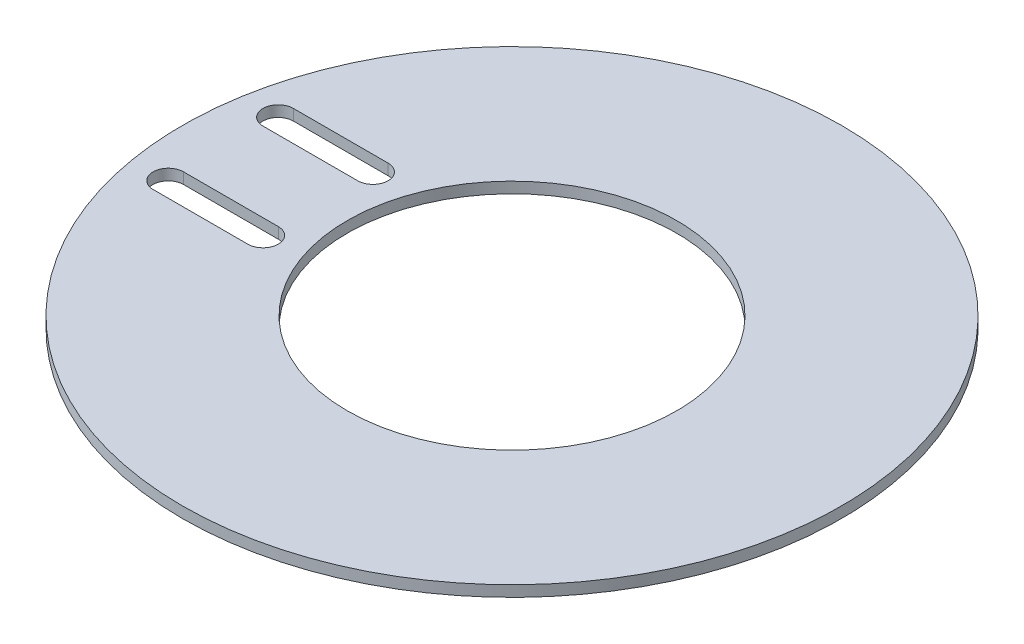
ISO-10303-21;
HEADER;
FILE_DESCRIPTION(('STEP AP214'),'2;1');
FILE_NAME('part.step','',(''),(''),'','','');
FILE_SCHEMA(('AUTOMOTIVE_DESIGN { 1 0 10303 214 1 1 1 1 }'));
ENDSEC;
DATA;
#1=APPLICATION_CONTEXT('core data for automotive mechanical design processes');
#2=APPLICATION_PROTOCOL_DEFINITION('international standard','automotive_design',2000,#1);
#3=PRODUCT_CONTEXT('',#1,'mechanical');
#4=PRODUCT('Part','Part','',(#3));
#5=PRODUCT_RELATED_PRODUCT_CATEGORY('part','',(#4));
#6=PRODUCT_DEFINITION_FORMATION('','',#4);
#7=PRODUCT_DEFINITION_CONTEXT('part definition',#1,'design');
#8=PRODUCT_DEFINITION('design','',#6,#7);
#9=PRODUCT_DEFINITION_SHAPE('','',#8);
#10=(LENGTH_UNIT() NAMED_UNIT(*) SI_UNIT(.MILLI.,.METRE.));
#11=(NAMED_UNIT(*) PLANE_ANGLE_UNIT() SI_UNIT($,.RADIAN.));
#12=(NAMED_UNIT(*) SI_UNIT($,.STERADIAN.) SOLID_ANGLE_UNIT());
#13=UNCERTAINTY_MEASURE_WITH_UNIT(LENGTH_MEASURE(1.E-05),#10,'distance_accuracy_value','');
#14=(GEOMETRIC_REPRESENTATION_CONTEXT(3) GLOBAL_UNCERTAINTY_ASSIGNED_CONTEXT((#13)) GLOBAL_UNIT_ASSIGNED_CONTEXT((#10,
#11,#12)) REPRESENTATION_CONTEXT('',''));
#15=CARTESIAN_POINT('',(0.,0.,0.));
#16=DIRECTION('',(0.,0.,1.));
#17=DIRECTION('',(1.,0.,0.));
#18=AXIS2_PLACEMENT_3D('',#15,#16,#17);
#19=CARTESIAN_POINT('',(-36.9908571611625,31.4452,0.));
#20=DIRECTION('',(0.,1.,0.));
#21=DIRECTION('',(0.,0.,1.));
#22=AXIS2_PLACEMENT_3D('',#19,#20,#21);
#23=PLANE('',#22);
#24=CARTESIAN_POINT('',(-36.9908571611625,31.4452,0.));
#25=DIRECTION('',(0.,1.,0.));
#26=DIRECTION('',(0.,0.,1.));
#27=AXIS2_PLACEMENT_3D('',#24,#25,#26);
#28=CIRCLE('',#27,1810.512);
#29=CARTESIAN_POINT('',(-36.9908571611625,31.4452,1810.512));
#30=VERTEX_POINT('',#29);
#31=EDGE_CURVE('E11',#30,#30,#28,.T.);
#32=ORIENTED_EDGE('',*,*,#31,.T.);
#33=EDGE_LOOP('',(#32));
#34=FACE_BOUND('',#33,.T.);
#35=CARTESIAN_POINT('',(-36.9908571611625,31.4452,0.));
#36=DIRECTION('',(0.,1.,0.));
#37=DIRECTION('',(0.,0.,1.));
#38=AXIS2_PLACEMENT_3D('',#35,#36,#37);
#39=CIRCLE('',#38,905.256);
#40=CARTESIAN_POINT('',(-36.9908571611625,31.4452,905.256));
#41=VERTEX_POINT('',#40);
#42=EDGE_CURVE('E172',#41,#41,#39,.T.);
#43=ORIENTED_EDGE('',*,*,#42,.F.);
#44=EDGE_LOOP('',(#43));
#45=FACE_BOUND('',#44,.T.);
#46=DIRECTION('',(1.,0.,0.));
#47=VECTOR('',#46,1.);
#48=CARTESIAN_POINT('',(-1623.3628169712,31.4452,-217.967199131942));
#49=LINE('',#48,#47);
#50=CARTESIAN_POINT('',(-1623.3628169712,31.4452,-217.967199131942));
#51=VERTEX_POINT('',#50);
#52=CARTESIAN_POINT('',(-1102.88671838462,31.4452,-217.967199131942));
#53=VERTEX_POINT('',#52);
#54=EDGE_CURVE('E143',#51,#53,#49,.T.);
#55=ORIENTED_EDGE('',*,*,#54,.F.);
#56=CARTESIAN_POINT('',(-1623.3628169712,31.4452,-301.752));
#57=DIRECTION('',(0.,1.,0.));
#58=DIRECTION('',(0.,0.,1.));
#59=AXIS2_PLACEMENT_3D('',#56,#57,#58);
#60=CIRCLE('',#59,83.7848008680577);
#61=CARTESIAN_POINT('',(-1623.3628169712,31.4452,-385.536800868058));
#62=VERTEX_POINT('',#61);
#63=EDGE_CURVE('E141',#62,#51,#60,.T.);
#64=ORIENTED_EDGE('',*,*,#63,.F.);
#65=DIRECTION('',(-1.,0.,0.));
#66=VECTOR('',#65,1.);
#67=CARTESIAN_POINT('',(-1623.3628169712,31.4452,-385.536800868058));
#68=LINE('',#67,#66);
#69=CARTESIAN_POINT('',(-1102.88671838462,31.4452,-385.536800868058));
#70=VERTEX_POINT('',#69);
#71=EDGE_CURVE('E149',#70,#62,#68,.T.);
#72=ORIENTED_EDGE('',*,*,#71,.F.);
#73=CARTESIAN_POINT('',(-1102.88671838462,31.4452,-301.752));
#74=DIRECTION('',(0.,1.,0.));
#75=DIRECTION('',(0.,0.,1.));
#76=AXIS2_PLACEMENT_3D('',#73,#74,#75);
#77=CIRCLE('',#76,83.7848008680577);
#78=EDGE_CURVE('E146',#53,#70,#77,.T.);
#79=ORIENTED_EDGE('',*,*,#78,.F.);
#80=EDGE_LOOP('',(#55,#64,#72,#79));
#81=FACE_BOUND('',#80,.T.);
#82=DIRECTION('',(1.,0.,0.));
#83=VECTOR('',#82,1.);
#84=CARTESIAN_POINT('',(-1623.3628169712,31.4452,385.536800868058));
#85=LINE('',#84,#83);
#86=CARTESIAN_POINT('',(-1623.3628169712,31.4452,385.536800868058));
#87=VERTEX_POINT('',#86);
#88=CARTESIAN_POINT('',(-1102.88671838462,31.4452,385.536800868058));
#89=VERTEX_POINT('',#88);
#90=EDGE_CURVE('E113',#87,#89,#85,.T.);
#91=ORIENTED_EDGE('',*,*,#90,.F.);
#92=CARTESIAN_POINT('',(-1623.3628169712,31.4452,301.752));
#93=DIRECTION('',(0.,1.,0.));
#94=DIRECTION('',(0.,0.,-1.));
#95=AXIS2_PLACEMENT_3D('',#92,#93,#94);
#96=CIRCLE('',#95,83.7848008680577);
#97=CARTESIAN_POINT('',(-1623.3628169712,31.4452,217.967199131942));
#98=VERTEX_POINT('',#97);
#99=EDGE_CURVE('E105',#98,#87,#96,.T.);
#100=ORIENTED_EDGE('',*,*,#99,.F.);
#101=DIRECTION('',(-1.,0.,0.));
#102=VECTOR('',#101,1.);
#103=CARTESIAN_POINT('',(-1623.3628169712,31.4452,217.967199131942));
#104=LINE('',#103,#102);
#105=CARTESIAN_POINT('',(-1102.88671838462,31.4452,217.967199131942));
#106=VERTEX_POINT('',#105);
#107=EDGE_CURVE('E127',#106,#98,#104,.T.);
#108=ORIENTED_EDGE('',*,*,#107,.F.);
#109=CARTESIAN_POINT('',(-1102.88671838462,31.4452,301.752));
#110=DIRECTION('',(0.,1.,0.));
#111=DIRECTION('',(0.,0.,-1.));
#112=AXIS2_PLACEMENT_3D('',#109,#110,#111);
#113=CIRCLE('',#112,83.7848008680577);
#114=EDGE_CURVE('E125',#89,#106,#113,.T.);
#115=ORIENTED_EDGE('',*,*,#114,.F.);
#116=EDGE_LOOP('',(#91,#100,#108,#115));
#117=FACE_BOUND('',#116,.T.);
#118=ADVANCED_FACE('F40',(#34,#45,#81,#117),#23,.T.);
#119=CARTESIAN_POINT('',(-36.9908571611625,-28.9052,0.));
#120=DIRECTION('',(0.,1.,0.));
#121=DIRECTION('',(0.,0.,1.));
#122=AXIS2_PLACEMENT_3D('',#119,#120,#121);
#123=PLANE('',#122);
#124=CARTESIAN_POINT('',(-1623.3628169712,-28.9052,-301.752));
#125=DIRECTION('',(0.,1.,0.));
#126=DIRECTION('',(0.,0.,1.));
#127=AXIS2_PLACEMENT_3D('',#124,#125,#126);
#128=CIRCLE('',#127,83.7848008680577);
#129=CARTESIAN_POINT('',(-1623.3628169712,-28.9052,-385.536800868058));
#130=VERTEX_POINT('',#129);
#131=CARTESIAN_POINT('',(-1623.3628169712,-28.9052,-217.967199131942));
#132=VERTEX_POINT('',#131);
#133=EDGE_CURVE('E121',#130,#132,#128,.T.);
#134=ORIENTED_EDGE('',*,*,#133,.T.);
#135=DIRECTION('',(1.,0.,0.));
#136=VECTOR('',#135,1.);
#137=CARTESIAN_POINT('',(-1623.3628169712,-28.9052,-217.967199131942));
#138=LINE('',#137,#136);
#139=CARTESIAN_POINT('',(-1102.88671838462,-28.9052,-217.967199131942));
#140=VERTEX_POINT('',#139);
#141=EDGE_CURVE('E154',#132,#140,#138,.T.);
#142=ORIENTED_EDGE('',*,*,#141,.T.);
#143=CARTESIAN_POINT('',(-1102.88671838462,-28.9052,-301.752));
#144=DIRECTION('',(0.,1.,0.));
#145=DIRECTION('',(0.,0.,1.));
#146=AXIS2_PLACEMENT_3D('',#143,#144,#145);
#147=CIRCLE('',#146,83.7848008680577);
#148=CARTESIAN_POINT('',(-1102.88671838462,-28.9052,-385.536800868058));
#149=VERTEX_POINT('',#148);
#150=EDGE_CURVE('E157',#140,#149,#147,.T.);
#151=ORIENTED_EDGE('',*,*,#150,.T.);
#152=DIRECTION('',(-1.,0.,0.));
#153=VECTOR('',#152,1.);
#154=CARTESIAN_POINT('',(-1623.3628169712,-28.9052,-385.536800868058));
#155=LINE('',#154,#153);
#156=EDGE_CURVE('E144',#149,#130,#155,.T.);
#157=ORIENTED_EDGE('',*,*,#156,.T.);
#158=EDGE_LOOP('',(#134,#142,#151,#157));
#159=FACE_BOUND('',#158,.T.);
#160=CARTESIAN_POINT('',(-36.9908571611625,-28.9052,0.));
#161=DIRECTION('',(0.,1.,0.));
#162=DIRECTION('',(0.,0.,1.));
#163=AXIS2_PLACEMENT_3D('',#160,#161,#162);
#164=CIRCLE('',#163,1810.512);
#165=CARTESIAN_POINT('',(-36.9908571611625,-28.9052,1810.512));
#166=VERTEX_POINT('',#165);
#167=EDGE_CURVE('E44',#166,#166,#164,.T.);
#168=ORIENTED_EDGE('',*,*,#167,.F.);
#169=EDGE_LOOP('',(#168));
#170=FACE_BOUND('',#169,.T.);
#171=CARTESIAN_POINT('',(-36.9908571611625,-28.9052,0.));
#172=DIRECTION('',(0.,1.,0.));
#173=DIRECTION('',(0.,0.,1.));
#174=AXIS2_PLACEMENT_3D('',#171,#172,#173);
#175=CIRCLE('',#174,905.256);
#176=CARTESIAN_POINT('',(-36.9908571611625,-28.9052,905.256));
#177=VERTEX_POINT('',#176);
#178=EDGE_CURVE('E171',#177,#177,#175,.T.);
#179=ORIENTED_EDGE('',*,*,#178,.T.);
#180=EDGE_LOOP('',(#179));
#181=FACE_BOUND('',#180,.T.);
#182=CARTESIAN_POINT('',(-1623.3628169712,-28.9052,301.752));
#183=DIRECTION('',(0.,1.,0.));
#184=DIRECTION('',(0.,0.,-1.));
#185=AXIS2_PLACEMENT_3D('',#182,#183,#184);
#186=CIRCLE('',#185,83.7848008680577);
#187=CARTESIAN_POINT('',(-1623.3628169712,-28.9052,217.967199131942));
#188=VERTEX_POINT('',#187);
#189=CARTESIAN_POINT('',(-1623.3628169712,-28.9052,385.536800868058));
#190=VERTEX_POINT('',#189);
#191=EDGE_CURVE('E63',#188,#190,#186,.T.);
#192=ORIENTED_EDGE('',*,*,#191,.T.);
#193=DIRECTION('',(1.,0.,0.));
#194=VECTOR('',#193,1.);
#195=CARTESIAN_POINT('',(-1623.3628169712,-28.9052,385.536800868058));
#196=LINE('',#195,#194);
#197=CARTESIAN_POINT('',(-1102.88671838462,-28.9052,385.536800868058));
#198=VERTEX_POINT('',#197);
#199=EDGE_CURVE('E120',#190,#198,#196,.T.);
#200=ORIENTED_EDGE('',*,*,#199,.T.);
#201=CARTESIAN_POINT('',(-1102.88671838462,-28.9052,301.752));
#202=DIRECTION('',(0.,1.,0.));
#203=DIRECTION('',(0.,0.,-1.));
#204=AXIS2_PLACEMENT_3D('',#201,#202,#203);
#205=CIRCLE('',#204,83.7848008680577);
#206=CARTESIAN_POINT('',(-1102.88671838462,-28.9052,217.967199131942));
#207=VERTEX_POINT('',#206);
#208=EDGE_CURVE('E133',#198,#207,#205,.T.);
#209=ORIENTED_EDGE('',*,*,#208,.T.);
#210=DIRECTION('',(-1.,0.,0.));
#211=VECTOR('',#210,1.);
#212=CARTESIAN_POINT('',(-1623.3628169712,-28.9052,217.967199131942));
#213=LINE('',#212,#211);
#214=EDGE_CURVE('E114',#207,#188,#213,.T.);
#215=ORIENTED_EDGE('',*,*,#214,.T.);
#216=EDGE_LOOP('',(#192,#200,#209,#215));
#217=FACE_BOUND('',#216,.T.);
#218=ADVANCED_FACE('F178',(#159,#170,#181,#217),#123,.F.);
#219=CARTESIAN_POINT('',(-36.9908571611625,31.4452,0.));
#220=DIRECTION('',(0.,-1.,0.));
#221=DIRECTION('',(0.,0.,-1.));
#222=AXIS2_PLACEMENT_3D('',#219,#220,#221);
#223=CYLINDRICAL_SURFACE('',#222,1810.512);
#224=ORIENTED_EDGE('',*,*,#31,.F.);
#225=EDGE_LOOP('',(#224));
#226=FACE_BOUND('',#225,.T.);
#227=ORIENTED_EDGE('',*,*,#167,.T.);
#228=EDGE_LOOP('',(#227));
#229=FACE_BOUND('',#228,.T.);
#230=ADVANCED_FACE('F42',(#226,#229),#223,.T.);
#231=CARTESIAN_POINT('',(-36.9908571611625,31.4452,0.));
#232=DIRECTION('',(0.,-1.,0.));
#233=DIRECTION('',(0.,0.,-1.));
#234=AXIS2_PLACEMENT_3D('',#231,#232,#233);
#235=CYLINDRICAL_SURFACE('',#234,905.256);
#236=ORIENTED_EDGE('',*,*,#42,.T.);
#237=EDGE_LOOP('',(#236));
#238=FACE_BOUND('',#237,.T.);
#239=ORIENTED_EDGE('',*,*,#178,.F.);
#240=EDGE_LOOP('',(#239));
#241=FACE_BOUND('',#240,.T.);
#242=ADVANCED_FACE('F181',(#238,#241),#235,.F.);
#243=CARTESIAN_POINT('',(-1623.3628169712,31.4452,-301.752));
#244=DIRECTION('',(0.,-1.,0.));
#245=DIRECTION('',(0.,0.,-1.));
#246=AXIS2_PLACEMENT_3D('',#243,#244,#245);
#247=CYLINDRICAL_SURFACE('',#246,83.7848008680577);
#248=ORIENTED_EDGE('',*,*,#133,.F.);
#249=DIRECTION('',(0.,-1.,0.));
#250=VECTOR('',#249,1.);
#251=CARTESIAN_POINT('',(-1623.3628169712,31.4452,-385.536800868058));
#252=LINE('',#251,#250);
#253=EDGE_CURVE('E151',#62,#130,#252,.T.);
#254=ORIENTED_EDGE('',*,*,#253,.F.);
#255=ORIENTED_EDGE('',*,*,#63,.T.);
#256=DIRECTION('',(0.,-1.,0.));
#257=VECTOR('',#256,1.);
#258=CARTESIAN_POINT('',(-1623.3628169712,31.4452,-217.967199131942));
#259=LINE('',#258,#257);
#260=EDGE_CURVE('E168',#51,#132,#259,.T.);
#261=ORIENTED_EDGE('',*,*,#260,.T.);
#262=EDGE_LOOP('',(#248,#254,#255,#261));
#263=FACE_BOUND('',#262,.T.);
#264=ADVANCED_FACE('F183',(#263),#247,.F.);
#265=CARTESIAN_POINT('',(-1623.3628169712,31.4452,-217.967199131942));
#266=DIRECTION('',(0.,0.,-1.));
#267=DIRECTION('',(-1.,0.,0.));
#268=AXIS2_PLACEMENT_3D('',#265,#266,#267);
#269=PLANE('',#268);
#270=ORIENTED_EDGE('',*,*,#141,.F.);
#271=ORIENTED_EDGE('',*,*,#260,.F.);
#272=ORIENTED_EDGE('',*,*,#54,.T.);
#273=DIRECTION('',(0.,-1.,0.));
#274=VECTOR('',#273,1.);
#275=CARTESIAN_POINT('',(-1102.88671838462,31.4452,-217.967199131942));
#276=LINE('',#275,#274);
#277=EDGE_CURVE('E166',#53,#140,#276,.T.);
#278=ORIENTED_EDGE('',*,*,#277,.T.);
#279=EDGE_LOOP('',(#270,#271,#272,#278));
#280=FACE_BOUND('',#279,.T.);
#281=ADVANCED_FACE('F190',(#280),#269,.T.);
#282=CARTESIAN_POINT('',(-1102.88671838462,31.4452,-301.752));
#283=DIRECTION('',(0.,-1.,0.));
#284=DIRECTION('',(0.,0.,-1.));
#285=AXIS2_PLACEMENT_3D('',#282,#283,#284);
#286=CYLINDRICAL_SURFACE('',#285,83.7848008680577);
#287=ORIENTED_EDGE('',*,*,#150,.F.);
#288=ORIENTED_EDGE('',*,*,#277,.F.);
#289=ORIENTED_EDGE('',*,*,#78,.T.);
#290=DIRECTION('',(0.,-1.,0.));
#291=VECTOR('',#290,1.);
#292=CARTESIAN_POINT('',(-1102.88671838462,31.4452,-385.536800868058));
#293=LINE('',#292,#291);
#294=EDGE_CURVE('E164',#70,#149,#293,.T.);
#295=ORIENTED_EDGE('',*,*,#294,.T.);
#296=EDGE_LOOP('',(#287,#288,#289,#295));
#297=FACE_BOUND('',#296,.T.);
#298=ADVANCED_FACE('F214',(#297),#286,.F.);
#299=CARTESIAN_POINT('',(-1623.3628169712,31.4452,-385.536800868058));
#300=DIRECTION('',(0.,0.,1.));
#301=DIRECTION('',(1.,0.,0.));
#302=AXIS2_PLACEMENT_3D('',#299,#300,#301);
#303=PLANE('',#302);
#304=ORIENTED_EDGE('',*,*,#156,.F.);
#305=ORIENTED_EDGE('',*,*,#294,.F.);
#306=ORIENTED_EDGE('',*,*,#71,.T.);
#307=ORIENTED_EDGE('',*,*,#253,.T.);
#308=EDGE_LOOP('',(#304,#305,#306,#307));
#309=FACE_BOUND('',#308,.T.);
#310=ADVANCED_FACE('F219',(#309),#303,.T.);
#311=CARTESIAN_POINT('',(-1623.3628169712,31.4452,301.752));
#312=DIRECTION('',(0.,-1.,0.));
#313=DIRECTION('',(0.,0.,-1.));
#314=AXIS2_PLACEMENT_3D('',#311,#312,#313);
#315=CYLINDRICAL_SURFACE('',#314,83.7848008680577);
#316=ORIENTED_EDGE('',*,*,#191,.F.);
#317=DIRECTION('',(0.,-1.,0.));
#318=VECTOR('',#317,1.);
#319=CARTESIAN_POINT('',(-1623.3628169712,31.4452,217.967199131942));
#320=LINE('',#319,#318);
#321=EDGE_CURVE('E109',#98,#188,#320,.T.);
#322=ORIENTED_EDGE('',*,*,#321,.F.);
#323=ORIENTED_EDGE('',*,*,#99,.T.);
#324=DIRECTION('',(0.,-1.,0.));
#325=VECTOR('',#324,1.);
#326=CARTESIAN_POINT('',(-1623.3628169712,31.4452,385.536800868058));
#327=LINE('',#326,#325);
#328=EDGE_CURVE('E108',#87,#190,#327,.T.);
#329=ORIENTED_EDGE('',*,*,#328,.T.);
#330=EDGE_LOOP('',(#316,#322,#323,#329));
#331=FACE_BOUND('',#330,.T.);
#332=ADVANCED_FACE('F107',(#331),#315,.F.);
#333=CARTESIAN_POINT('',(-1623.3628169712,31.4452,385.536800868058));
#334=DIRECTION('',(0.,0.,-1.));
#335=DIRECTION('',(-1.,0.,0.));
#336=AXIS2_PLACEMENT_3D('',#333,#334,#335);
#337=PLANE('',#336);
#338=ORIENTED_EDGE('',*,*,#199,.F.);
#339=ORIENTED_EDGE('',*,*,#328,.F.);
#340=ORIENTED_EDGE('',*,*,#90,.T.);
#341=DIRECTION('',(0.,-1.,0.));
#342=VECTOR('',#341,1.);
#343=CARTESIAN_POINT('',(-1102.88671838462,31.4452,385.536800868058));
#344=LINE('',#343,#342);
#345=EDGE_CURVE('E122',#89,#198,#344,.T.);
#346=ORIENTED_EDGE('',*,*,#345,.T.);
#347=EDGE_LOOP('',(#338,#339,#340,#346));
#348=FACE_BOUND('',#347,.T.);
#349=ADVANCED_FACE('F117',(#348),#337,.T.);
#350=CARTESIAN_POINT('',(-1102.88671838462,31.4452,301.752));
#351=DIRECTION('',(0.,-1.,0.));
#352=DIRECTION('',(0.,0.,-1.));
#353=AXIS2_PLACEMENT_3D('',#350,#351,#352);
#354=CYLINDRICAL_SURFACE('',#353,83.7848008680577);
#355=ORIENTED_EDGE('',*,*,#208,.F.);
#356=ORIENTED_EDGE('',*,*,#345,.F.);
#357=ORIENTED_EDGE('',*,*,#114,.T.);
#358=DIRECTION('',(0.,-1.,0.));
#359=VECTOR('',#358,1.);
#360=CARTESIAN_POINT('',(-1102.88671838462,31.4452,217.967199131942));
#361=LINE('',#360,#359);
#362=EDGE_CURVE('E55',#106,#207,#361,.T.);
#363=ORIENTED_EDGE('',*,*,#362,.T.);
#364=EDGE_LOOP('',(#355,#356,#357,#363));
#365=FACE_BOUND('',#364,.T.);
#366=ADVANCED_FACE('F258',(#365),#354,.F.);
#367=CARTESIAN_POINT('',(-1623.3628169712,31.4452,217.967199131942));
#368=DIRECTION('',(0.,0.,1.));
#369=DIRECTION('',(1.,0.,0.));
#370=AXIS2_PLACEMENT_3D('',#367,#368,#369);
#371=PLANE('',#370);
#372=ORIENTED_EDGE('',*,*,#214,.F.);
#373=ORIENTED_EDGE('',*,*,#362,.F.);
#374=ORIENTED_EDGE('',*,*,#107,.T.);
#375=ORIENTED_EDGE('',*,*,#321,.T.);
#376=EDGE_LOOP('',(#372,#373,#374,#375));
#377=FACE_BOUND('',#376,.T.);
#378=ADVANCED_FACE('F266',(#377),#371,.T.);
#379=CLOSED_SHELL('',(#118,#218,#230,#242,#264,#281,#298,#310,#332,#349,#366,#378));
#380=MANIFOLD_SOLID_BREP('B2',#379);
#381=ADVANCED_BREP_SHAPE_REPRESENTATION('',(#18,#380),#14);
#382=SHAPE_DEFINITION_REPRESENTATION(#9,#381);
ENDSEC;
END-ISO-10303-21;
